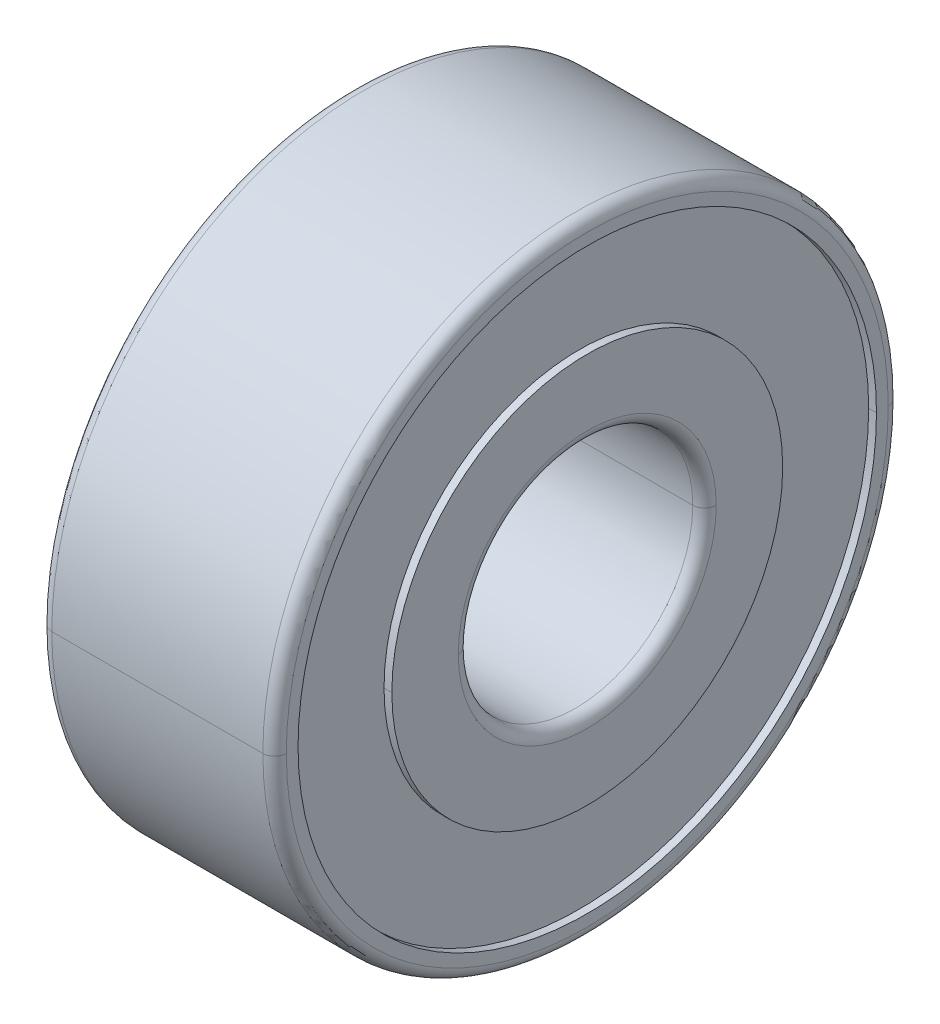
ISO-10303-21;
HEADER;
FILE_DESCRIPTION(('STEP AP214'),'2;1');
FILE_NAME('part.step','',(''),(''),'','','');
FILE_SCHEMA(('AUTOMOTIVE_DESIGN { 1 0 10303 214 1 1 1 1 }'));
ENDSEC;
DATA;
#1=APPLICATION_CONTEXT('core data for automotive mechanical design processes');
#2=APPLICATION_PROTOCOL_DEFINITION('international standard','automotive_design',2000,#1);
#3=PRODUCT_CONTEXT('',#1,'mechanical');
#4=PRODUCT('Part','Part','',(#3));
#5=PRODUCT_RELATED_PRODUCT_CATEGORY('part','',(#4));
#6=PRODUCT_DEFINITION_FORMATION('','',#4);
#7=PRODUCT_DEFINITION_CONTEXT('part definition',#1,'design');
#8=PRODUCT_DEFINITION('design','',#6,#7);
#9=PRODUCT_DEFINITION_SHAPE('','',#8);
#10=(LENGTH_UNIT() NAMED_UNIT(*) SI_UNIT(.MILLI.,.METRE.));
#11=(NAMED_UNIT(*) PLANE_ANGLE_UNIT() SI_UNIT($,.RADIAN.));
#12=(NAMED_UNIT(*) SI_UNIT($,.STERADIAN.) SOLID_ANGLE_UNIT());
#13=UNCERTAINTY_MEASURE_WITH_UNIT(LENGTH_MEASURE(1.E-05),#10,'distance_accuracy_value','');
#14=(GEOMETRIC_REPRESENTATION_CONTEXT(3) GLOBAL_UNCERTAINTY_ASSIGNED_CONTEXT((#13)) GLOBAL_UNIT_ASSIGNED_CONTEXT((#10,
#11,#12)) REPRESENTATION_CONTEXT('',''));
#15=CARTESIAN_POINT('',(0.,0.,0.));
#16=DIRECTION('',(0.,0.,1.));
#17=DIRECTION('',(1.,0.,0.));
#18=AXIS2_PLACEMENT_3D('',#15,#16,#17);
#19=CARTESIAN_POINT('',(0.75,0.,0.));
#20=DIRECTION('',(-1.,0.,0.));
#21=DIRECTION('',(0.,0.,1.));
#22=AXIS2_PLACEMENT_3D('',#19,#20,#21);
#23=CYLINDRICAL_SURFACE('',#22,1.5);
#24=DIRECTION('',(-1.,0.,0.));
#25=VECTOR('',#24,1.);
#26=CARTESIAN_POINT('',(0.75,0.,-1.5));
#27=LINE('',#26,#25);
#28=CARTESIAN_POINT('',(1.35,0.,-1.5));
#29=VERTEX_POINT('',#28);
#30=CARTESIAN_POINT('',(-1.35,0.,-1.5));
#31=VERTEX_POINT('',#30);
#32=EDGE_CURVE('E237',#29,#31,#27,.T.);
#33=ORIENTED_EDGE('',*,*,#32,.F.);
#34=CARTESIAN_POINT('',(1.35,0.,0.));
#35=DIRECTION('',(1.,0.,0.));
#36=DIRECTION('',(0.,0.,1.));
#37=AXIS2_PLACEMENT_3D('',#34,#35,#36);
#38=CIRCLE('',#37,1.5);
#39=CARTESIAN_POINT('',(1.35,0.,1.5));
#40=VERTEX_POINT('',#39);
#41=EDGE_CURVE('E250',#29,#40,#38,.T.);
#42=ORIENTED_EDGE('',*,*,#41,.T.);
#43=DIRECTION('',(-1.,0.,0.));
#44=VECTOR('',#43,1.);
#45=CARTESIAN_POINT('',(0.75,0.,1.5));
#46=LINE('',#45,#44);
#47=CARTESIAN_POINT('',(-1.35,0.,1.5));
#48=VERTEX_POINT('',#47);
#49=EDGE_CURVE('E198',#40,#48,#46,.T.);
#50=ORIENTED_EDGE('',*,*,#49,.T.);
#51=CARTESIAN_POINT('',(-1.35,0.,0.));
#52=DIRECTION('',(1.,0.,0.));
#53=DIRECTION('',(0.,0.,1.));
#54=AXIS2_PLACEMENT_3D('',#51,#52,#53);
#55=CIRCLE('',#54,1.5);
#56=EDGE_CURVE('E231',#31,#48,#55,.T.);
#57=ORIENTED_EDGE('',*,*,#56,.F.);
#58=EDGE_LOOP('',(#33,#42,#50,#57));
#59=FACE_BOUND('',#58,.T.);
#60=ADVANCED_FACE('F17',(#59),#23,.F.);
#61=CARTESIAN_POINT('',(1.5,0.,2.));
#62=DIRECTION('',(-1.,0.,0.));
#63=DIRECTION('',(0.,0.,1.));
#64=AXIS2_PLACEMENT_3D('',#61,#62,#63);
#65=PLANE('',#64);
#66=CARTESIAN_POINT('',(1.5,0.,0.));
#67=DIRECTION('',(-1.,0.,0.));
#68=DIRECTION('',(0.,0.,1.));
#69=AXIS2_PLACEMENT_3D('',#66,#67,#68);
#70=CIRCLE('',#69,1.65);
#71=CARTESIAN_POINT('',(1.5,0.,1.65));
#72=VERTEX_POINT('',#71);
#73=CARTESIAN_POINT('',(1.5,0.,-1.65));
#74=VERTEX_POINT('',#73);
#75=EDGE_CURVE('E210',#72,#74,#70,.T.);
#76=ORIENTED_EDGE('',*,*,#75,.T.);
#77=CARTESIAN_POINT('',(1.5,0.,0.));
#78=DIRECTION('',(-1.,0.,0.));
#79=DIRECTION('',(0.,0.,1.));
#80=AXIS2_PLACEMENT_3D('',#77,#78,#79);
#81=CIRCLE('',#80,1.65);
#82=EDGE_CURVE('E219',#74,#72,#81,.T.);
#83=ORIENTED_EDGE('',*,*,#82,.T.);
#84=EDGE_LOOP('',(#76,#83));
#85=FACE_BOUND('',#84,.T.);
#86=CARTESIAN_POINT('',(1.5,0.,0.));
#87=DIRECTION('',(-1.,0.,0.));
#88=DIRECTION('',(0.,0.,1.));
#89=AXIS2_PLACEMENT_3D('',#86,#87,#88);
#90=CIRCLE('',#89,2.5);
#91=CARTESIAN_POINT('',(1.5,0.,2.5));
#92=VERTEX_POINT('',#91);
#93=CARTESIAN_POINT('',(1.5,0.,-2.5));
#94=VERTEX_POINT('',#93);
#95=EDGE_CURVE('E202',#92,#94,#90,.T.);
#96=ORIENTED_EDGE('',*,*,#95,.F.);
#97=CARTESIAN_POINT('',(1.5,0.,0.));
#98=DIRECTION('',(-1.,0.,0.));
#99=DIRECTION('',(0.,0.,1.));
#100=AXIS2_PLACEMENT_3D('',#97,#98,#99);
#101=CIRCLE('',#100,2.5);
#102=EDGE_CURVE('E11',#94,#92,#101,.T.);
#103=ORIENTED_EDGE('',*,*,#102,.F.);
#104=EDGE_LOOP('',(#96,#103));
#105=FACE_BOUND('',#104,.T.);
#106=ADVANCED_FACE('F380',(#85,#105),#65,.F.);
#107=CARTESIAN_POINT('',(0.75,0.,0.));
#108=DIRECTION('',(-1.,0.,0.));
#109=DIRECTION('',(0.,0.,1.));
#110=AXIS2_PLACEMENT_3D('',#107,#108,#109);
#111=CYLINDRICAL_SURFACE('',#110,2.5);
#112=DIRECTION('',(-1.,0.,0.));
#113=VECTOR('',#112,1.);
#114=CARTESIAN_POINT('',(0.75,0.,-2.5));
#115=LINE('',#114,#113);
#116=CARTESIAN_POINT('',(1.4,0.,-2.5));
#117=VERTEX_POINT('',#116);
#118=EDGE_CURVE('E209',#94,#117,#115,.T.);
#119=ORIENTED_EDGE('',*,*,#118,.F.);
#120=ORIENTED_EDGE('',*,*,#102,.T.);
#121=DIRECTION('',(-1.,0.,0.));
#122=VECTOR('',#121,1.);
#123=CARTESIAN_POINT('',(0.75,0.,2.5));
#124=LINE('',#123,#122);
#125=CARTESIAN_POINT('',(1.4,0.,2.5));
#126=VERTEX_POINT('',#125);
#127=EDGE_CURVE('E208',#92,#126,#124,.T.);
#128=ORIENTED_EDGE('',*,*,#127,.T.);
#129=CARTESIAN_POINT('',(1.4,0.,0.));
#130=DIRECTION('',(-1.,0.,0.));
#131=DIRECTION('',(0.,0.,1.));
#132=AXIS2_PLACEMENT_3D('',#129,#130,#131);
#133=CIRCLE('',#132,2.5);
#134=EDGE_CURVE('E28',#117,#126,#133,.T.);
#135=ORIENTED_EDGE('',*,*,#134,.F.);
#136=EDGE_LOOP('',(#119,#120,#128,#135));
#137=FACE_BOUND('',#136,.T.);
#138=ADVANCED_FACE('F386',(#137),#111,.T.);
#139=CARTESIAN_POINT('',(1.4,0.,3.1));
#140=DIRECTION('',(-1.,0.,0.));
#141=DIRECTION('',(0.,0.,1.));
#142=AXIS2_PLACEMENT_3D('',#139,#140,#141);
#143=PLANE('',#142);
#144=CARTESIAN_POINT('',(1.4,0.,0.));
#145=DIRECTION('',(-1.,0.,0.));
#146=DIRECTION('',(0.,0.,1.));
#147=AXIS2_PLACEMENT_3D('',#144,#145,#146);
#148=CIRCLE('',#147,2.5);
#149=EDGE_CURVE('E204',#126,#117,#148,.T.);
#150=ORIENTED_EDGE('',*,*,#149,.T.);
#151=ORIENTED_EDGE('',*,*,#134,.T.);
#152=EDGE_LOOP('',(#150,#151));
#153=FACE_BOUND('',#152,.T.);
#154=CARTESIAN_POINT('',(1.4,0.,0.));
#155=DIRECTION('',(-1.,0.,0.));
#156=DIRECTION('',(0.,0.,1.));
#157=AXIS2_PLACEMENT_3D('',#154,#155,#156);
#158=CIRCLE('',#157,3.7);
#159=CARTESIAN_POINT('',(1.4,0.,3.7));
#160=VERTEX_POINT('',#159);
#161=CARTESIAN_POINT('',(1.4,0.,-3.7));
#162=VERTEX_POINT('',#161);
#163=EDGE_CURVE('E197',#160,#162,#158,.T.);
#164=ORIENTED_EDGE('',*,*,#163,.F.);
#165=CARTESIAN_POINT('',(1.4,0.,0.));
#166=DIRECTION('',(-1.,0.,0.));
#167=DIRECTION('',(0.,0.,1.));
#168=AXIS2_PLACEMENT_3D('',#165,#166,#167);
#169=CIRCLE('',#168,3.7);
#170=EDGE_CURVE('E308',#162,#160,#169,.T.);
#171=ORIENTED_EDGE('',*,*,#170,.F.);
#172=EDGE_LOOP('',(#164,#171));
#173=FACE_BOUND('',#172,.T.);
#174=ADVANCED_FACE('F605',(#153,#173),#143,.F.);
#175=CARTESIAN_POINT('',(0.75,0.,0.));
#176=DIRECTION('',(-1.,0.,0.));
#177=DIRECTION('',(0.,0.,1.));
#178=AXIS2_PLACEMENT_3D('',#175,#176,#177);
#179=CYLINDRICAL_SURFACE('',#178,3.7);
#180=DIRECTION('',(-1.,0.,0.));
#181=VECTOR('',#180,1.);
#182=CARTESIAN_POINT('',(0.75,0.,-3.7));
#183=LINE('',#182,#181);
#184=CARTESIAN_POINT('',(1.5,0.,-3.7));
#185=VERTEX_POINT('',#184);
#186=EDGE_CURVE('E259',#185,#162,#183,.T.);
#187=ORIENTED_EDGE('',*,*,#186,.F.);
#188=CARTESIAN_POINT('',(1.5,0.,0.));
#189=DIRECTION('',(-1.,0.,0.));
#190=DIRECTION('',(0.,0.,1.));
#191=AXIS2_PLACEMENT_3D('',#188,#189,#190);
#192=CIRCLE('',#191,3.7);
#193=CARTESIAN_POINT('',(1.5,0.,3.7));
#194=VERTEX_POINT('',#193);
#195=EDGE_CURVE('E268',#194,#185,#192,.T.);
#196=ORIENTED_EDGE('',*,*,#195,.F.);
#197=DIRECTION('',(-1.,0.,0.));
#198=VECTOR('',#197,1.);
#199=CARTESIAN_POINT('',(0.75,0.,3.7));
#200=LINE('',#199,#198);
#201=EDGE_CURVE('E312',#194,#160,#200,.T.);
#202=ORIENTED_EDGE('',*,*,#201,.T.);
#203=ORIENTED_EDGE('',*,*,#163,.T.);
#204=EDGE_LOOP('',(#187,#196,#202,#203));
#205=FACE_BOUND('',#204,.T.);
#206=ADVANCED_FACE('F19',(#205),#179,.F.);
#207=CARTESIAN_POINT('',(1.5,0.,3.85));
#208=DIRECTION('',(-1.,0.,0.));
#209=DIRECTION('',(0.,0.,1.));
#210=AXIS2_PLACEMENT_3D('',#207,#208,#209);
#211=PLANE('',#210);
#212=ORIENTED_EDGE('',*,*,#195,.T.);
#213=CARTESIAN_POINT('',(1.5,0.,0.));
#214=DIRECTION('',(-1.,0.,0.));
#215=DIRECTION('',(0.,0.,1.));
#216=AXIS2_PLACEMENT_3D('',#213,#214,#215);
#217=CIRCLE('',#216,3.7);
#218=EDGE_CURVE('E255',#185,#194,#217,.T.);
#219=ORIENTED_EDGE('',*,*,#218,.T.);
#220=EDGE_LOOP('',(#212,#219));
#221=FACE_BOUND('',#220,.T.);
#222=CARTESIAN_POINT('',(1.5,0.,0.));
#223=DIRECTION('',(1.,0.,0.));
#224=DIRECTION('',(0.,0.,1.));
#225=AXIS2_PLACEMENT_3D('',#222,#223,#224);
#226=CIRCLE('',#225,3.85);
#227=CARTESIAN_POINT('',(1.5,0.,3.85));
#228=VERTEX_POINT('',#227);
#229=CARTESIAN_POINT('',(1.5,0.,-3.85));
#230=VERTEX_POINT('',#229);
#231=EDGE_CURVE('E215',#228,#230,#226,.T.);
#232=ORIENTED_EDGE('',*,*,#231,.T.);
#233=CARTESIAN_POINT('',(1.5,0.,0.));
#234=DIRECTION('',(1.,0.,0.));
#235=DIRECTION('',(0.,0.,1.));
#236=AXIS2_PLACEMENT_3D('',#233,#234,#235);
#237=CIRCLE('',#236,3.85);
#238=EDGE_CURVE('E272',#230,#228,#237,.T.);
#239=ORIENTED_EDGE('',*,*,#238,.T.);
#240=EDGE_LOOP('',(#232,#239));
#241=FACE_BOUND('',#240,.T.);
#242=ADVANCED_FACE('F604',(#221,#241),#211,.F.);
#243=CARTESIAN_POINT('',(0.75,0.,0.));
#244=DIRECTION('',(-1.,0.,0.));
#245=DIRECTION('',(0.,0.,1.));
#246=AXIS2_PLACEMENT_3D('',#243,#244,#245);
#247=CYLINDRICAL_SURFACE('',#246,4.);
#248=DIRECTION('',(-1.,0.,0.));
#249=VECTOR('',#248,1.);
#250=CARTESIAN_POINT('',(0.75,0.,-4.));
#251=LINE('',#250,#249);
#252=CARTESIAN_POINT('',(1.35,0.,-4.));
#253=VERTEX_POINT('',#252);
#254=CARTESIAN_POINT('',(-1.35,0.,-4.));
#255=VERTEX_POINT('',#254);
#256=EDGE_CURVE('E328',#253,#255,#251,.T.);
#257=ORIENTED_EDGE('',*,*,#256,.F.);
#258=CARTESIAN_POINT('',(1.35,0.,0.));
#259=DIRECTION('',(-1.,0.,0.));
#260=DIRECTION('',(0.,0.,1.));
#261=AXIS2_PLACEMENT_3D('',#258,#259,#260);
#262=CIRCLE('',#261,4.);
#263=CARTESIAN_POINT('',(1.35,0.,4.));
#264=VERTEX_POINT('',#263);
#265=EDGE_CURVE('E142',#253,#264,#262,.T.);
#266=ORIENTED_EDGE('',*,*,#265,.T.);
#267=DIRECTION('',(-1.,0.,0.));
#268=VECTOR('',#267,1.);
#269=CARTESIAN_POINT('',(0.75,0.,4.));
#270=LINE('',#269,#268);
#271=CARTESIAN_POINT('',(-1.35,0.,4.));
#272=VERTEX_POINT('',#271);
#273=EDGE_CURVE('E277',#264,#272,#270,.T.);
#274=ORIENTED_EDGE('',*,*,#273,.T.);
#275=CARTESIAN_POINT('',(-1.35,0.,0.));
#276=DIRECTION('',(-1.,0.,0.));
#277=DIRECTION('',(0.,0.,1.));
#278=AXIS2_PLACEMENT_3D('',#275,#276,#277);
#279=CIRCLE('',#278,4.);
#280=EDGE_CURVE('E130',#255,#272,#279,.T.);
#281=ORIENTED_EDGE('',*,*,#280,.F.);
#282=EDGE_LOOP('',(#257,#266,#274,#281));
#283=FACE_BOUND('',#282,.T.);
#284=ADVANCED_FACE('F459',(#283),#247,.T.);
#285=CARTESIAN_POINT('',(1.35,0.,0.));
#286=DIRECTION('',(-1.,0.,0.));
#287=DIRECTION('',(0.,0.,1.));
#288=AXIS2_PLACEMENT_3D('',#285,#286,#287);
#289=TOROIDAL_SURFACE('',#288,3.85,0.15);
#290=CARTESIAN_POINT('',(1.35,0.,-3.85));
#291=DIRECTION('',(0.,1.,0.));
#292=DIRECTION('',(0.,0.,1.));
#293=AXIS2_PLACEMENT_3D('',#290,#291,#292);
#294=CIRCLE('',#293,0.15);
#295=EDGE_CURVE('E276',#230,#253,#294,.T.);
#296=ORIENTED_EDGE('',*,*,#295,.F.);
#297=ORIENTED_EDGE('',*,*,#231,.F.);
#298=CARTESIAN_POINT('',(1.35,0.,3.85));
#299=DIRECTION('',(0.,-1.,0.));
#300=DIRECTION('',(0.,0.,-1.));
#301=AXIS2_PLACEMENT_3D('',#298,#299,#300);
#302=CIRCLE('',#301,0.15);
#303=EDGE_CURVE('E254',#228,#264,#302,.T.);
#304=ORIENTED_EDGE('',*,*,#303,.T.);
#305=ORIENTED_EDGE('',*,*,#265,.F.);
#306=EDGE_LOOP('',(#296,#297,#304,#305));
#307=FACE_BOUND('',#306,.T.);
#308=ADVANCED_FACE('F360',(#307),#289,.T.);
#309=CARTESIAN_POINT('',(1.35,0.,0.));
#310=DIRECTION('',(-1.,0.,0.));
#311=DIRECTION('',(0.,0.,1.));
#312=AXIS2_PLACEMENT_3D('',#309,#310,#311);
#313=TOROIDAL_SURFACE('',#312,1.65,0.15);
#314=CARTESIAN_POINT('',(1.35,0.,-1.65));
#315=DIRECTION('',(0.,1.,0.));
#316=DIRECTION('',(0.,0.,1.));
#317=AXIS2_PLACEMENT_3D('',#314,#315,#316);
#318=CIRCLE('',#317,0.15);
#319=EDGE_CURVE('E214',#29,#74,#318,.T.);
#320=ORIENTED_EDGE('',*,*,#319,.F.);
#321=CARTESIAN_POINT('',(1.35,0.,0.));
#322=DIRECTION('',(1.,0.,0.));
#323=DIRECTION('',(0.,0.,1.));
#324=AXIS2_PLACEMENT_3D('',#321,#322,#323);
#325=CIRCLE('',#324,1.5);
#326=EDGE_CURVE('E241',#40,#29,#325,.T.);
#327=ORIENTED_EDGE('',*,*,#326,.F.);
#328=CARTESIAN_POINT('',(1.35,0.,1.65));
#329=DIRECTION('',(0.,-1.,0.));
#330=DIRECTION('',(0.,0.,-1.));
#331=AXIS2_PLACEMENT_3D('',#328,#329,#330);
#332=CIRCLE('',#331,0.15);
#333=EDGE_CURVE('E191',#40,#72,#332,.T.);
#334=ORIENTED_EDGE('',*,*,#333,.T.);
#335=ORIENTED_EDGE('',*,*,#82,.F.);
#336=EDGE_LOOP('',(#320,#327,#334,#335));
#337=FACE_BOUND('',#336,.T.);
#338=ADVANCED_FACE('F444',(#337),#313,.T.);
#339=CARTESIAN_POINT('',(-1.5,0.,2.));
#340=DIRECTION('',(1.,0.,0.));
#341=DIRECTION('',(0.,1.,0.));
#342=AXIS2_PLACEMENT_3D('',#339,#340,#341);
#343=PLANE('',#342);
#344=CARTESIAN_POINT('',(-1.5,0.,0.));
#345=DIRECTION('',(-1.,0.,0.));
#346=DIRECTION('',(0.,0.,1.));
#347=AXIS2_PLACEMENT_3D('',#344,#345,#346);
#348=CIRCLE('',#347,1.65);
#349=CARTESIAN_POINT('',(-1.5,0.,1.65));
#350=VERTEX_POINT('',#349);
#351=CARTESIAN_POINT('',(-1.5,0.,-1.65));
#352=VERTEX_POINT('',#351);
#353=EDGE_CURVE('E42',#350,#352,#348,.T.);
#354=ORIENTED_EDGE('',*,*,#353,.F.);
#355=CARTESIAN_POINT('',(-1.5,0.,0.));
#356=DIRECTION('',(-1.,0.,0.));
#357=DIRECTION('',(0.,0.,1.));
#358=AXIS2_PLACEMENT_3D('',#355,#356,#357);
#359=CIRCLE('',#358,1.65);
#360=EDGE_CURVE('E232',#352,#350,#359,.T.);
#361=ORIENTED_EDGE('',*,*,#360,.F.);
#362=EDGE_LOOP('',(#354,#361));
#363=FACE_BOUND('',#362,.T.);
#364=CARTESIAN_POINT('',(-1.5,0.,0.));
#365=DIRECTION('',(-1.,0.,0.));
#366=DIRECTION('',(0.,0.,1.));
#367=AXIS2_PLACEMENT_3D('',#364,#365,#366);
#368=CIRCLE('',#367,2.5);
#369=CARTESIAN_POINT('',(-1.5,0.,2.5));
#370=VERTEX_POINT('',#369);
#371=CARTESIAN_POINT('',(-1.5,0.,-2.5));
#372=VERTEX_POINT('',#371);
#373=EDGE_CURVE('E173',#370,#372,#368,.T.);
#374=ORIENTED_EDGE('',*,*,#373,.T.);
#375=CARTESIAN_POINT('',(-1.5,0.,0.));
#376=DIRECTION('',(-1.,0.,0.));
#377=DIRECTION('',(0.,0.,1.));
#378=AXIS2_PLACEMENT_3D('',#375,#376,#377);
#379=CIRCLE('',#378,2.5);
#380=EDGE_CURVE('E183',#372,#370,#379,.T.);
#381=ORIENTED_EDGE('',*,*,#380,.T.);
#382=EDGE_LOOP('',(#374,#381));
#383=FACE_BOUND('',#382,.T.);
#384=ADVANCED_FACE('F392',(#363,#383),#343,.F.);
#385=CARTESIAN_POINT('',(-0.75,0.,0.));
#386=DIRECTION('',(1.,0.,0.));
#387=DIRECTION('',(0.,0.,1.));
#388=AXIS2_PLACEMENT_3D('',#385,#386,#387);
#389=CYLINDRICAL_SURFACE('',#388,2.5);
#390=DIRECTION('',(1.,0.,0.));
#391=VECTOR('',#390,1.);
#392=CARTESIAN_POINT('',(-0.75,0.,-2.5));
#393=LINE('',#392,#391);
#394=CARTESIAN_POINT('',(-1.4,0.,-2.5));
#395=VERTEX_POINT('',#394);
#396=EDGE_CURVE('E166',#372,#395,#393,.T.);
#397=ORIENTED_EDGE('',*,*,#396,.F.);
#398=ORIENTED_EDGE('',*,*,#373,.F.);
#399=DIRECTION('',(1.,0.,0.));
#400=VECTOR('',#399,1.);
#401=CARTESIAN_POINT('',(-0.75,0.,2.5));
#402=LINE('',#401,#400);
#403=CARTESIAN_POINT('',(-1.4,0.,2.5));
#404=VERTEX_POINT('',#403);
#405=EDGE_CURVE('E169',#370,#404,#402,.T.);
#406=ORIENTED_EDGE('',*,*,#405,.T.);
#407=CARTESIAN_POINT('',(-1.4,0.,0.));
#408=DIRECTION('',(-1.,0.,0.));
#409=DIRECTION('',(0.,0.,1.));
#410=AXIS2_PLACEMENT_3D('',#407,#408,#409);
#411=CIRCLE('',#410,2.5);
#412=EDGE_CURVE('E21',#404,#395,#411,.T.);
#413=ORIENTED_EDGE('',*,*,#412,.T.);
#414=EDGE_LOOP('',(#397,#398,#406,#413));
#415=FACE_BOUND('',#414,.T.);
#416=ADVANCED_FACE('F164',(#415),#389,.T.);
#417=CARTESIAN_POINT('',(-1.4,0.,3.1));
#418=DIRECTION('',(1.,0.,0.));
#419=DIRECTION('',(0.,1.,0.));
#420=AXIS2_PLACEMENT_3D('',#417,#418,#419);
#421=PLANE('',#420);
#422=ORIENTED_EDGE('',*,*,#412,.F.);
#423=CARTESIAN_POINT('',(-1.4,0.,0.));
#424=DIRECTION('',(-1.,0.,0.));
#425=DIRECTION('',(0.,0.,1.));
#426=AXIS2_PLACEMENT_3D('',#423,#424,#425);
#427=CIRCLE('',#426,2.5);
#428=EDGE_CURVE('E175',#395,#404,#427,.T.);
#429=ORIENTED_EDGE('',*,*,#428,.F.);
#430=EDGE_LOOP('',(#422,#429));
#431=FACE_BOUND('',#430,.T.);
#432=CARTESIAN_POINT('',(-1.4,0.,0.));
#433=DIRECTION('',(-1.,0.,0.));
#434=DIRECTION('',(0.,0.,1.));
#435=AXIS2_PLACEMENT_3D('',#432,#433,#434);
#436=CIRCLE('',#435,3.7);
#437=CARTESIAN_POINT('',(-1.4,0.,3.7));
#438=VERTEX_POINT('',#437);
#439=CARTESIAN_POINT('',(-1.4,0.,-3.7));
#440=VERTEX_POINT('',#439);
#441=EDGE_CURVE('E227',#438,#440,#436,.T.);
#442=ORIENTED_EDGE('',*,*,#441,.T.);
#443=CARTESIAN_POINT('',(-1.4,0.,0.));
#444=DIRECTION('',(-1.,0.,0.));
#445=DIRECTION('',(0.,0.,1.));
#446=AXIS2_PLACEMENT_3D('',#443,#444,#445);
#447=CIRCLE('',#446,3.7);
#448=EDGE_CURVE('E174',#440,#438,#447,.T.);
#449=ORIENTED_EDGE('',*,*,#448,.T.);
#450=EDGE_LOOP('',(#442,#449));
#451=FACE_BOUND('',#450,.T.);
#452=ADVANCED_FACE('F176',(#431,#451),#421,.F.);
#453=CARTESIAN_POINT('',(-0.75,0.,0.));
#454=DIRECTION('',(1.,0.,0.));
#455=DIRECTION('',(0.,0.,1.));
#456=AXIS2_PLACEMENT_3D('',#453,#454,#455);
#457=CYLINDRICAL_SURFACE('',#456,3.7);
#458=DIRECTION('',(1.,0.,0.));
#459=VECTOR('',#458,1.);
#460=CARTESIAN_POINT('',(-0.75,0.,-3.7));
#461=LINE('',#460,#459);
#462=CARTESIAN_POINT('',(-1.5,0.,-3.7));
#463=VERTEX_POINT('',#462);
#464=EDGE_CURVE('E223',#463,#440,#461,.T.);
#465=ORIENTED_EDGE('',*,*,#464,.F.);
#466=CARTESIAN_POINT('',(-1.5,0.,0.));
#467=DIRECTION('',(-1.,0.,0.));
#468=DIRECTION('',(0.,0.,1.));
#469=AXIS2_PLACEMENT_3D('',#466,#467,#468);
#470=CIRCLE('',#469,3.7);
#471=CARTESIAN_POINT('',(-1.5,0.,3.7));
#472=VERTEX_POINT('',#471);
#473=EDGE_CURVE('E249',#463,#472,#470,.T.);
#474=ORIENTED_EDGE('',*,*,#473,.T.);
#475=DIRECTION('',(1.,0.,0.));
#476=VECTOR('',#475,1.);
#477=CARTESIAN_POINT('',(-0.75,0.,3.7));
#478=LINE('',#477,#476);
#479=EDGE_CURVE('E195',#472,#438,#478,.T.);
#480=ORIENTED_EDGE('',*,*,#479,.T.);
#481=ORIENTED_EDGE('',*,*,#448,.F.);
#482=EDGE_LOOP('',(#465,#474,#480,#481));
#483=FACE_BOUND('',#482,.T.);
#484=ADVANCED_FACE('F414',(#483),#457,.F.);
#485=CARTESIAN_POINT('',(-1.5,0.,3.85));
#486=DIRECTION('',(1.,0.,0.));
#487=DIRECTION('',(0.,1.,0.));
#488=AXIS2_PLACEMENT_3D('',#485,#486,#487);
#489=PLANE('',#488);
#490=CARTESIAN_POINT('',(-1.5,0.,0.));
#491=DIRECTION('',(-1.,0.,0.));
#492=DIRECTION('',(0.,0.,1.));
#493=AXIS2_PLACEMENT_3D('',#490,#491,#492);
#494=CIRCLE('',#493,3.7);
#495=EDGE_CURVE('E222',#472,#463,#494,.T.);
#496=ORIENTED_EDGE('',*,*,#495,.F.);
#497=ORIENTED_EDGE('',*,*,#473,.F.);
#498=EDGE_LOOP('',(#496,#497));
#499=FACE_BOUND('',#498,.T.);
#500=CARTESIAN_POINT('',(-1.5,0.,0.));
#501=DIRECTION('',(1.,0.,0.));
#502=DIRECTION('',(0.,0.,1.));
#503=AXIS2_PLACEMENT_3D('',#500,#501,#502);
#504=CIRCLE('',#503,3.85);
#505=CARTESIAN_POINT('',(-1.5,0.,3.85));
#506=VERTEX_POINT('',#505);
#507=CARTESIAN_POINT('',(-1.5,0.,-3.85));
#508=VERTEX_POINT('',#507);
#509=EDGE_CURVE('E236',#506,#508,#504,.T.);
#510=ORIENTED_EDGE('',*,*,#509,.F.);
#511=CARTESIAN_POINT('',(-1.5,0.,0.));
#512=DIRECTION('',(1.,0.,0.));
#513=DIRECTION('',(0.,0.,1.));
#514=AXIS2_PLACEMENT_3D('',#511,#512,#513);
#515=CIRCLE('',#514,3.85);
#516=EDGE_CURVE('E245',#508,#506,#515,.T.);
#517=ORIENTED_EDGE('',*,*,#516,.F.);
#518=EDGE_LOOP('',(#510,#517));
#519=FACE_BOUND('',#518,.T.);
#520=ADVANCED_FACE('F407',(#499,#519),#489,.F.);
#521=CARTESIAN_POINT('',(-1.35,0.,0.));
#522=DIRECTION('',(1.,0.,0.));
#523=DIRECTION('',(0.,0.,1.));
#524=AXIS2_PLACEMENT_3D('',#521,#522,#523);
#525=TOROIDAL_SURFACE('',#524,3.85,0.15);
#526=CARTESIAN_POINT('',(-1.35,0.,-3.85));
#527=DIRECTION('',(0.,-1.,0.));
#528=DIRECTION('',(0.,0.,-1.));
#529=AXIS2_PLACEMENT_3D('',#526,#527,#528);
#530=CIRCLE('',#529,0.15);
#531=EDGE_CURVE('E233',#508,#255,#530,.T.);
#532=ORIENTED_EDGE('',*,*,#531,.F.);
#533=ORIENTED_EDGE('',*,*,#516,.T.);
#534=CARTESIAN_POINT('',(-1.35,0.,3.85));
#535=DIRECTION('',(0.,1.,0.));
#536=DIRECTION('',(0.,0.,1.));
#537=AXIS2_PLACEMENT_3D('',#534,#535,#536);
#538=CIRCLE('',#537,0.15);
#539=EDGE_CURVE('E283',#506,#272,#538,.T.);
#540=ORIENTED_EDGE('',*,*,#539,.T.);
#541=CARTESIAN_POINT('',(-1.35,0.,0.));
#542=DIRECTION('',(-1.,0.,0.));
#543=DIRECTION('',(0.,0.,1.));
#544=AXIS2_PLACEMENT_3D('',#541,#542,#543);
#545=CIRCLE('',#544,4.);
#546=EDGE_CURVE('E340',#272,#255,#545,.T.);
#547=ORIENTED_EDGE('',*,*,#546,.T.);
#548=EDGE_LOOP('',(#532,#533,#540,#547));
#549=FACE_BOUND('',#548,.T.);
#550=ADVANCED_FACE('F404',(#549),#525,.T.);
#551=CARTESIAN_POINT('',(-1.35,0.,0.));
#552=DIRECTION('',(1.,0.,0.));
#553=DIRECTION('',(0.,0.,1.));
#554=AXIS2_PLACEMENT_3D('',#551,#552,#553);
#555=TOROIDAL_SURFACE('',#554,1.65,0.15);
#556=CARTESIAN_POINT('',(-1.35,0.,-1.65));
#557=DIRECTION('',(0.,-1.,0.));
#558=DIRECTION('',(0.,0.,-1.));
#559=AXIS2_PLACEMENT_3D('',#556,#557,#558);
#560=CIRCLE('',#559,0.15);
#561=EDGE_CURVE('E280',#31,#352,#560,.T.);
#562=ORIENTED_EDGE('',*,*,#561,.F.);
#563=ORIENTED_EDGE('',*,*,#56,.T.);
#564=CARTESIAN_POINT('',(-1.35,0.,1.65));
#565=DIRECTION('',(0.,1.,0.));
#566=DIRECTION('',(0.,0.,1.));
#567=AXIS2_PLACEMENT_3D('',#564,#565,#566);
#568=CIRCLE('',#567,0.15);
#569=EDGE_CURVE('E228',#48,#350,#568,.T.);
#570=ORIENTED_EDGE('',*,*,#569,.T.);
#571=ORIENTED_EDGE('',*,*,#353,.T.);
#572=EDGE_LOOP('',(#562,#563,#570,#571));
#573=FACE_BOUND('',#572,.T.);
#574=ADVANCED_FACE('F406',(#573),#555,.T.);
#575=CARTESIAN_POINT('',(-1.35,0.,0.));
#576=DIRECTION('',(1.,0.,0.));
#577=DIRECTION('',(0.,0.,1.));
#578=AXIS2_PLACEMENT_3D('',#575,#576,#577);
#579=TOROIDAL_SURFACE('',#578,1.65,0.15);
#580=CARTESIAN_POINT('',(-1.35,0.,0.));
#581=DIRECTION('',(1.,0.,0.));
#582=DIRECTION('',(0.,0.,1.));
#583=AXIS2_PLACEMENT_3D('',#580,#581,#582);
#584=CIRCLE('',#583,1.5);
#585=EDGE_CURVE('E203',#48,#31,#584,.T.);
#586=ORIENTED_EDGE('',*,*,#585,.T.);
#587=ORIENTED_EDGE('',*,*,#561,.T.);
#588=ORIENTED_EDGE('',*,*,#360,.T.);
#589=ORIENTED_EDGE('',*,*,#569,.F.);
#590=EDGE_LOOP('',(#586,#587,#588,#589));
#591=FACE_BOUND('',#590,.T.);
#592=ADVANCED_FACE('F398',(#591),#579,.T.);
#593=CARTESIAN_POINT('',(-1.35,0.,0.));
#594=DIRECTION('',(1.,0.,0.));
#595=DIRECTION('',(0.,0.,1.));
#596=AXIS2_PLACEMENT_3D('',#593,#594,#595);
#597=TOROIDAL_SURFACE('',#596,3.85,0.15);
#598=ORIENTED_EDGE('',*,*,#509,.T.);
#599=ORIENTED_EDGE('',*,*,#531,.T.);
#600=ORIENTED_EDGE('',*,*,#280,.T.);
#601=ORIENTED_EDGE('',*,*,#539,.F.);
#602=EDGE_LOOP('',(#598,#599,#600,#601));
#603=FACE_BOUND('',#602,.T.);
#604=ADVANCED_FACE('F394',(#603),#597,.T.);
#605=CARTESIAN_POINT('',(-0.75,0.,0.));
#606=DIRECTION('',(1.,0.,0.));
#607=DIRECTION('',(0.,0.,1.));
#608=AXIS2_PLACEMENT_3D('',#605,#606,#607);
#609=CYLINDRICAL_SURFACE('',#608,3.7);
#610=ORIENTED_EDGE('',*,*,#495,.T.);
#611=ORIENTED_EDGE('',*,*,#464,.T.);
#612=ORIENTED_EDGE('',*,*,#441,.F.);
#613=ORIENTED_EDGE('',*,*,#479,.F.);
#614=EDGE_LOOP('',(#610,#611,#612,#613));
#615=FACE_BOUND('',#614,.T.);
#616=ADVANCED_FACE('F397',(#615),#609,.F.);
#617=CARTESIAN_POINT('',(-0.75,0.,0.));
#618=DIRECTION('',(1.,0.,0.));
#619=DIRECTION('',(0.,0.,1.));
#620=AXIS2_PLACEMENT_3D('',#617,#618,#619);
#621=CYLINDRICAL_SURFACE('',#620,2.5);
#622=ORIENTED_EDGE('',*,*,#380,.F.);
#623=ORIENTED_EDGE('',*,*,#396,.T.);
#624=ORIENTED_EDGE('',*,*,#428,.T.);
#625=ORIENTED_EDGE('',*,*,#405,.F.);
#626=EDGE_LOOP('',(#622,#623,#624,#625));
#627=FACE_BOUND('',#626,.T.);
#628=ADVANCED_FACE('F181',(#627),#621,.T.);
#629=CARTESIAN_POINT('',(1.35,0.,0.));
#630=DIRECTION('',(-1.,0.,0.));
#631=DIRECTION('',(0.,0.,1.));
#632=AXIS2_PLACEMENT_3D('',#629,#630,#631);
#633=TOROIDAL_SURFACE('',#632,1.65,0.15);
#634=ORIENTED_EDGE('',*,*,#41,.F.);
#635=ORIENTED_EDGE('',*,*,#319,.T.);
#636=ORIENTED_EDGE('',*,*,#75,.F.);
#637=ORIENTED_EDGE('',*,*,#333,.F.);
#638=EDGE_LOOP('',(#634,#635,#636,#637));
#639=FACE_BOUND('',#638,.T.);
#640=ADVANCED_FACE('F366',(#639),#633,.T.);
#641=CARTESIAN_POINT('',(1.35,0.,0.));
#642=DIRECTION('',(-1.,0.,0.));
#643=DIRECTION('',(0.,0.,1.));
#644=AXIS2_PLACEMENT_3D('',#641,#642,#643);
#645=TOROIDAL_SURFACE('',#644,3.85,0.15);
#646=ORIENTED_EDGE('',*,*,#238,.F.);
#647=ORIENTED_EDGE('',*,*,#295,.T.);
#648=CARTESIAN_POINT('',(1.35,0.,0.));
#649=DIRECTION('',(-1.,0.,0.));
#650=DIRECTION('',(0.,0.,1.));
#651=AXIS2_PLACEMENT_3D('',#648,#649,#650);
#652=CIRCLE('',#651,4.);
#653=EDGE_CURVE('E324',#264,#253,#652,.T.);
#654=ORIENTED_EDGE('',*,*,#653,.F.);
#655=ORIENTED_EDGE('',*,*,#303,.F.);
#656=EDGE_LOOP('',(#646,#647,#654,#655));
#657=FACE_BOUND('',#656,.T.);
#658=ADVANCED_FACE('F364',(#657),#645,.T.);
#659=CARTESIAN_POINT('',(0.75,0.,0.));
#660=DIRECTION('',(-1.,0.,0.));
#661=DIRECTION('',(0.,0.,1.));
#662=AXIS2_PLACEMENT_3D('',#659,#660,#661);
#663=CYLINDRICAL_SURFACE('',#662,4.);
#664=ORIENTED_EDGE('',*,*,#653,.T.);
#665=ORIENTED_EDGE('',*,*,#256,.T.);
#666=ORIENTED_EDGE('',*,*,#546,.F.);
#667=ORIENTED_EDGE('',*,*,#273,.F.);
#668=EDGE_LOOP('',(#664,#665,#666,#667));
#669=FACE_BOUND('',#668,.T.);
#670=ADVANCED_FACE('F363',(#669),#663,.T.);
#671=CARTESIAN_POINT('',(0.75,0.,0.));
#672=DIRECTION('',(-1.,0.,0.));
#673=DIRECTION('',(0.,0.,1.));
#674=AXIS2_PLACEMENT_3D('',#671,#672,#673);
#675=CYLINDRICAL_SURFACE('',#674,3.7);
#676=ORIENTED_EDGE('',*,*,#218,.F.);
#677=ORIENTED_EDGE('',*,*,#186,.T.);
#678=ORIENTED_EDGE('',*,*,#170,.T.);
#679=ORIENTED_EDGE('',*,*,#201,.F.);
#680=EDGE_LOOP('',(#676,#677,#678,#679));
#681=FACE_BOUND('',#680,.T.);
#682=ADVANCED_FACE('F373',(#681),#675,.F.);
#683=CARTESIAN_POINT('',(0.75,0.,0.));
#684=DIRECTION('',(-1.,0.,0.));
#685=DIRECTION('',(0.,0.,1.));
#686=AXIS2_PLACEMENT_3D('',#683,#684,#685);
#687=CYLINDRICAL_SURFACE('',#686,2.5);
#688=ORIENTED_EDGE('',*,*,#95,.T.);
#689=ORIENTED_EDGE('',*,*,#118,.T.);
#690=ORIENTED_EDGE('',*,*,#149,.F.);
#691=ORIENTED_EDGE('',*,*,#127,.F.);
#692=EDGE_LOOP('',(#688,#689,#690,#691));
#693=FACE_BOUND('',#692,.T.);
#694=ADVANCED_FACE('F402',(#693),#687,.T.);
#695=CARTESIAN_POINT('',(0.75,0.,0.));
#696=DIRECTION('',(-1.,0.,0.));
#697=DIRECTION('',(0.,0.,1.));
#698=AXIS2_PLACEMENT_3D('',#695,#696,#697);
#699=CYLINDRICAL_SURFACE('',#698,1.5);
#700=ORIENTED_EDGE('',*,*,#326,.T.);
#701=ORIENTED_EDGE('',*,*,#32,.T.);
#702=ORIENTED_EDGE('',*,*,#585,.F.);
#703=ORIENTED_EDGE('',*,*,#49,.F.);
#704=EDGE_LOOP('',(#700,#701,#702,#703));
#705=FACE_BOUND('',#704,.T.);
#706=ADVANCED_FACE('F400',(#705),#699,.F.);
#707=CLOSED_SHELL('',(#60,#106,#138,#174,#206,#242,#284,#308,#338,#384,#416,#452,#484,#520,#550,
#574,#592,#604,#616,#628,#640,#658,#670,#682,#694,#706));
#708=MANIFOLD_SOLID_BREP('B1',#707);
#709=ADVANCED_BREP_SHAPE_REPRESENTATION('',(#18,#708),#14);
#710=SHAPE_DEFINITION_REPRESENTATION(#9,#709);
ENDSEC;
END-ISO-10303-21;
